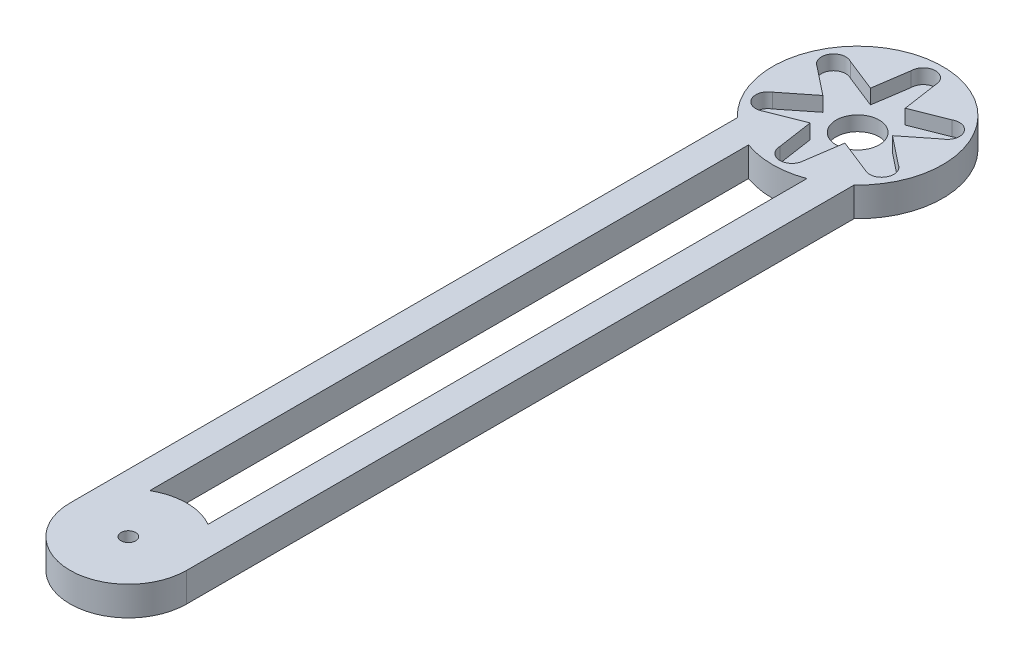
ISO-10303-21;
HEADER;
FILE_DESCRIPTION(('STEP AP214'),'2;1');
FILE_NAME('part.step','',(''),(''),'','','');
FILE_SCHEMA(('AUTOMOTIVE_DESIGN { 1 0 10303 214 1 1 1 1 }'));
ENDSEC;
DATA;
#1=APPLICATION_CONTEXT('core data for automotive mechanical design processes');
#2=APPLICATION_PROTOCOL_DEFINITION('international standard','automotive_design',2000,#1);
#3=PRODUCT_CONTEXT('',#1,'mechanical');
#4=PRODUCT('Part','Part','',(#3));
#5=PRODUCT_RELATED_PRODUCT_CATEGORY('part','',(#4));
#6=PRODUCT_DEFINITION_FORMATION('','',#4);
#7=PRODUCT_DEFINITION_CONTEXT('part definition',#1,'design');
#8=PRODUCT_DEFINITION('design','',#6,#7);
#9=PRODUCT_DEFINITION_SHAPE('','',#8);
#10=(LENGTH_UNIT() NAMED_UNIT(*) SI_UNIT(.MILLI.,.METRE.));
#11=(NAMED_UNIT(*) PLANE_ANGLE_UNIT() SI_UNIT($,.RADIAN.));
#12=(NAMED_UNIT(*) SI_UNIT($,.STERADIAN.) SOLID_ANGLE_UNIT());
#13=UNCERTAINTY_MEASURE_WITH_UNIT(LENGTH_MEASURE(1.E-05),#10,'distance_accuracy_value','');
#14=(GEOMETRIC_REPRESENTATION_CONTEXT(3) GLOBAL_UNCERTAINTY_ASSIGNED_CONTEXT((#13)) GLOBAL_UNIT_ASSIGNED_CONTEXT((#10,
#11,#12)) REPRESENTATION_CONTEXT('',''));
#15=CARTESIAN_POINT('',(0.,0.,0.));
#16=DIRECTION('',(0.,0.,1.));
#17=DIRECTION('',(1.,0.,0.));
#18=AXIS2_PLACEMENT_3D('',#15,#16,#17);
#19=CARTESIAN_POINT('',(0.,6.,0.));
#20=DIRECTION('',(0.,-1.,0.));
#21=DIRECTION('',(0.,0.,-1.));
#22=AXIS2_PLACEMENT_3D('',#19,#20,#21);
#23=CYLINDRICAL_SURFACE('',#22,17.5);
#24=DIRECTION('',(0.,-1.,0.));
#25=VECTOR('',#24,1.);
#26=CARTESIAN_POINT('',(-12.,6.,12.737739202857));
#27=LINE('',#26,#25);
#28=CARTESIAN_POINT('',(-12.,6.,12.737739202857));
#29=VERTEX_POINT('',#28);
#30=CARTESIAN_POINT('',(-12.,0.,12.737739202857));
#31=VERTEX_POINT('',#30);
#32=EDGE_CURVE('E117',#29,#31,#27,.T.);
#33=ORIENTED_EDGE('',*,*,#32,.F.);
#34=CARTESIAN_POINT('',(0.,6.,0.));
#35=DIRECTION('',(0.,1.,0.));
#36=DIRECTION('',(0.,0.,1.));
#37=AXIS2_PLACEMENT_3D('',#34,#35,#36);
#38=CIRCLE('',#37,17.5);
#39=CARTESIAN_POINT('',(12.,6.,12.737739202857));
#40=VERTEX_POINT('',#39);
#41=EDGE_CURVE('E444',#40,#29,#38,.T.);
#42=ORIENTED_EDGE('',*,*,#41,.F.);
#43=DIRECTION('',(0.,-1.,0.));
#44=VECTOR('',#43,1.);
#45=CARTESIAN_POINT('',(12.,6.,12.737739202857));
#46=LINE('',#45,#44);
#47=CARTESIAN_POINT('',(12.,0.,12.737739202857));
#48=VERTEX_POINT('',#47);
#49=EDGE_CURVE('E335',#40,#48,#46,.T.);
#50=ORIENTED_EDGE('',*,*,#49,.T.);
#51=CARTESIAN_POINT('',(0.,0.,0.));
#52=DIRECTION('',(0.,1.,0.));
#53=DIRECTION('',(0.,0.,1.));
#54=AXIS2_PLACEMENT_3D('',#51,#52,#53);
#55=CIRCLE('',#54,17.5);
#56=EDGE_CURVE('E398',#48,#31,#55,.T.);
#57=ORIENTED_EDGE('',*,*,#56,.T.);
#58=EDGE_LOOP('',(#33,#42,#50,#57));
#59=FACE_BOUND('',#58,.T.);
#60=ADVANCED_FACE('F94',(#59),#23,.T.);
#61=CARTESIAN_POINT('',(-11.6913429510899,6.,-6.74999999999999));
#62=DIRECTION('',(0.,-1.,0.));
#63=DIRECTION('',(0.,0.,-1.));
#64=AXIS2_PLACEMENT_3D('',#61,#62,#63);
#65=CYLINDRICAL_SURFACE('',#64,2.5);
#66=CARTESIAN_POINT('',(-11.6913429510899,3.,-6.74999999999999));
#67=DIRECTION('',(0.,1.,0.));
#68=DIRECTION('',(0.,0.,1.));
#69=AXIS2_PLACEMENT_3D('',#66,#67,#68);
#70=CIRCLE('',#69,2.5);
#71=CARTESIAN_POINT('',(-10.4413429510899,3.,-8.91506350946109));
#72=VERTEX_POINT('',#71);
#73=CARTESIAN_POINT('',(-12.9413429510899,3.,-4.58493649053889));
#74=VERTEX_POINT('',#73);
#75=EDGE_CURVE('E365',#72,#74,#70,.T.);
#76=ORIENTED_EDGE('',*,*,#75,.F.);
#77=DIRECTION('',(0.,-1.,0.));
#78=VECTOR('',#77,1.);
#79=CARTESIAN_POINT('',(-10.4413429510899,6.,-8.91506350946109));
#80=LINE('',#79,#78);
#81=CARTESIAN_POINT('',(-10.4413429510899,6.,-8.91506350946109));
#82=VERTEX_POINT('',#81);
#83=EDGE_CURVE('E12',#82,#72,#80,.T.);
#84=ORIENTED_EDGE('',*,*,#83,.F.);
#85=CARTESIAN_POINT('',(-11.6913429510899,6.,-6.74999999999999));
#86=DIRECTION('',(0.,1.,0.));
#87=DIRECTION('',(0.,0.,1.));
#88=AXIS2_PLACEMENT_3D('',#85,#86,#87);
#89=CIRCLE('',#88,2.5);
#90=CARTESIAN_POINT('',(-12.9413429510899,6.,-4.58493649053889));
#91=VERTEX_POINT('',#90);
#92=EDGE_CURVE('E394',#82,#91,#89,.T.);
#93=ORIENTED_EDGE('',*,*,#92,.T.);
#94=DIRECTION('',(0.,-1.,0.));
#95=VECTOR('',#94,1.);
#96=CARTESIAN_POINT('',(-12.9413429510899,6.,-4.58493649053889));
#97=LINE('',#96,#95);
#98=EDGE_CURVE('E446',#91,#74,#97,.T.);
#99=ORIENTED_EDGE('',*,*,#98,.T.);
#100=EDGE_LOOP('',(#76,#84,#93,#99));
#101=FACE_BOUND('',#100,.T.);
#102=ADVANCED_FACE('F96',(#101),#65,.F.);
#103=CARTESIAN_POINT('',(1.63672705202787,6.,-4.13959239881188));
#104=DIRECTION('',(0.367686867782864,0.,-0.929949658454707));
#105=DIRECTION('',(-0.929949658454707,0.,-0.367686867782864));
#106=AXIS2_PLACEMENT_3D('',#103,#104,#105);
#107=PLANE('',#106);
#108=ORIENTED_EDGE('',*,*,#83,.T.);
#109=DIRECTION('',(0.929949658454707,0.,0.367686867782864));
#110=VECTOR('',#109,1.);
#111=CARTESIAN_POINT('',(1.63672705202787,3.,-4.13959239881188));
#112=LINE('',#111,#110);
#113=CARTESIAN_POINT('',(-3.58109149415789,3.,-6.20263241443421));
#114=VERTEX_POINT('',#113);
#115=EDGE_CURVE('E363',#72,#114,#112,.T.);
#116=ORIENTED_EDGE('',*,*,#115,.T.);
#117=DIRECTION('',(0.,-1.,0.));
#118=VECTOR('',#117,1.);
#119=CARTESIAN_POINT('',(-3.58109149415789,6.,-6.20263241443421));
#120=LINE('',#119,#118);
#121=CARTESIAN_POINT('',(-3.58109149415789,6.,-6.20263241443421));
#122=VERTEX_POINT('',#121);
#123=EDGE_CURVE('E102',#122,#114,#120,.T.);
#124=ORIENTED_EDGE('',*,*,#123,.F.);
#125=DIRECTION('',(0.929949658454707,0.,0.367686867782864));
#126=VECTOR('',#125,1.);
#127=CARTESIAN_POINT('',(1.63672705202787,6.,-4.13959239881188));
#128=LINE('',#127,#126);
#129=EDGE_CURVE('E397',#82,#122,#128,.T.);
#130=ORIENTED_EDGE('',*,*,#129,.F.);
#131=EDGE_LOOP('',(#108,#116,#124,#130));
#132=FACE_BOUND('',#131,.T.);
#133=ADVANCED_FACE('F515',(#132),#107,.F.);
#134=CARTESIAN_POINT('',(-4.40335570469799,6.,-0.65234899328859));
#135=DIRECTION('',(0.989203462353871,0.,0.146548661089462));
#136=DIRECTION('',(0.146548661089462,0.,-0.989203462353871));
#137=AXIS2_PLACEMENT_3D('',#134,#135,#136);
#138=PLANE('',#137);
#139=DIRECTION('',(-0.146548661089462,0.,0.989203462353871));
#140=VECTOR('',#139,1.);
#141=CARTESIAN_POINT('',(-4.40335570469799,3.,-0.65234899328859));
#142=LINE('',#141,#140);
#143=CARTESIAN_POINT('',(-2.5,3.,-13.5));
#144=VERTEX_POINT('',#143);
#145=EDGE_CURVE('E360',#144,#114,#142,.T.);
#146=ORIENTED_EDGE('',*,*,#145,.F.);
#147=DIRECTION('',(0.,-1.,0.));
#148=VECTOR('',#147,1.);
#149=CARTESIAN_POINT('',(-2.5,6.,-13.5));
#150=LINE('',#149,#148);
#151=CARTESIAN_POINT('',(-2.5,6.,-13.5));
#152=VERTEX_POINT('',#151);
#153=EDGE_CURVE('E490',#152,#144,#150,.T.);
#154=ORIENTED_EDGE('',*,*,#153,.F.);
#155=DIRECTION('',(-0.146548661089462,0.,0.989203462353871));
#156=VECTOR('',#155,1.);
#157=CARTESIAN_POINT('',(-4.40335570469799,6.,-0.65234899328859));
#158=LINE('',#157,#156);
#159=EDGE_CURVE('E400',#152,#122,#158,.T.);
#160=ORIENTED_EDGE('',*,*,#159,.T.);
#161=ORIENTED_EDGE('',*,*,#123,.T.);
#162=EDGE_LOOP('',(#146,#154,#160,#161));
#163=FACE_BOUND('',#162,.T.);
#164=ADVANCED_FACE('F495',(#163),#138,.T.);
#165=CARTESIAN_POINT('',(0.,6.,-13.5));
#166=DIRECTION('',(0.,-1.,0.));
#167=DIRECTION('',(0.,0.,-1.));
#168=AXIS2_PLACEMENT_3D('',#165,#166,#167);
#169=CYLINDRICAL_SURFACE('',#168,2.5);
#170=CARTESIAN_POINT('',(0.,3.,-13.5));
#171=DIRECTION('',(0.,1.,0.));
#172=DIRECTION('',(0.,0.,1.));
#173=AXIS2_PLACEMENT_3D('',#170,#171,#172);
#174=CIRCLE('',#173,2.5);
#175=CARTESIAN_POINT('',(2.5,3.,-13.5));
#176=VERTEX_POINT('',#175);
#177=EDGE_CURVE('E357',#176,#144,#174,.T.);
#178=ORIENTED_EDGE('',*,*,#177,.F.);
#179=DIRECTION('',(0.,-1.,0.));
#180=VECTOR('',#179,1.);
#181=CARTESIAN_POINT('',(2.5,6.,-13.5));
#182=LINE('',#181,#180);
#183=CARTESIAN_POINT('',(2.5,6.,-13.5));
#184=VERTEX_POINT('',#183);
#185=EDGE_CURVE('E487',#184,#176,#182,.T.);
#186=ORIENTED_EDGE('',*,*,#185,.F.);
#187=CARTESIAN_POINT('',(0.,6.,-13.5));
#188=DIRECTION('',(0.,1.,0.));
#189=DIRECTION('',(0.,0.,1.));
#190=AXIS2_PLACEMENT_3D('',#187,#188,#189);
#191=CIRCLE('',#190,2.5);
#192=EDGE_CURVE('E403',#184,#152,#191,.T.);
#193=ORIENTED_EDGE('',*,*,#192,.T.);
#194=ORIENTED_EDGE('',*,*,#153,.T.);
#195=EDGE_LOOP('',(#178,#186,#193,#194));
#196=FACE_BOUND('',#195,.T.);
#197=ADVANCED_FACE('F505',(#196),#169,.F.);
#198=CARTESIAN_POINT('',(4.40335570469799,6.,-0.65234899328859));
#199=DIRECTION('',(0.989203462353871,0.,-0.146548661089462));
#200=DIRECTION('',(-0.146548661089462,0.,-0.989203462353871));
#201=AXIS2_PLACEMENT_3D('',#198,#199,#200);
#202=PLANE('',#201);
#203=ORIENTED_EDGE('',*,*,#185,.T.);
#204=DIRECTION('',(0.146548661089462,0.,0.989203462353871));
#205=VECTOR('',#204,1.);
#206=CARTESIAN_POINT('',(4.40335570469799,3.,-0.65234899328859));
#207=LINE('',#206,#205);
#208=CARTESIAN_POINT('',(3.58109149415789,3.,-6.20263241443422));
#209=VERTEX_POINT('',#208);
#210=EDGE_CURVE('E355',#176,#209,#207,.T.);
#211=ORIENTED_EDGE('',*,*,#210,.T.);
#212=DIRECTION('',(0.,-1.,0.));
#213=VECTOR('',#212,1.);
#214=CARTESIAN_POINT('',(3.58109149415789,6.,-6.20263241443422));
#215=LINE('',#214,#213);
#216=CARTESIAN_POINT('',(3.58109149415789,6.,-6.20263241443422));
#217=VERTEX_POINT('',#216);
#218=EDGE_CURVE('E484',#217,#209,#215,.T.);
#219=ORIENTED_EDGE('',*,*,#218,.F.);
#220=DIRECTION('',(0.146548661089462,0.,0.989203462353871));
#221=VECTOR('',#220,1.);
#222=CARTESIAN_POINT('',(4.40335570469799,6.,-0.65234899328859));
#223=LINE('',#222,#221);
#224=EDGE_CURVE('E406',#184,#217,#223,.T.);
#225=ORIENTED_EDGE('',*,*,#224,.F.);
#226=EDGE_LOOP('',(#203,#211,#219,#225));
#227=FACE_BOUND('',#226,.T.);
#228=ADVANCED_FACE('F508',(#227),#202,.F.);
#229=CARTESIAN_POINT('',(-1.63672705202787,6.,-4.13959239881188));
#230=DIRECTION('',(0.367686867782865,0.,0.929949658454707));
#231=DIRECTION('',(0.929949658454707,0.,-0.367686867782865));
#232=AXIS2_PLACEMENT_3D('',#229,#230,#231);
#233=PLANE('',#232);
#234=DIRECTION('',(-0.929949658454707,0.,0.367686867782865));
#235=VECTOR('',#234,1.);
#236=CARTESIAN_POINT('',(-1.63672705202787,3.,-4.13959239881188));
#237=LINE('',#236,#235);
#238=CARTESIAN_POINT('',(10.4413429510899,3.,-8.9150635094611));
#239=VERTEX_POINT('',#238);
#240=EDGE_CURVE('E352',#239,#209,#237,.T.);
#241=ORIENTED_EDGE('',*,*,#240,.F.);
#242=DIRECTION('',(0.,-1.,0.));
#243=VECTOR('',#242,1.);
#244=CARTESIAN_POINT('',(10.4413429510899,6.,-8.9150635094611));
#245=LINE('',#244,#243);
#246=CARTESIAN_POINT('',(10.4413429510899,6.,-8.9150635094611));
#247=VERTEX_POINT('',#246);
#248=EDGE_CURVE('E481',#247,#239,#245,.T.);
#249=ORIENTED_EDGE('',*,*,#248,.F.);
#250=DIRECTION('',(-0.929949658454707,0.,0.367686867782865));
#251=VECTOR('',#250,1.);
#252=CARTESIAN_POINT('',(-1.63672705202787,6.,-4.13959239881188));
#253=LINE('',#252,#251);
#254=EDGE_CURVE('E408',#247,#217,#253,.T.);
#255=ORIENTED_EDGE('',*,*,#254,.T.);
#256=ORIENTED_EDGE('',*,*,#218,.T.);
#257=EDGE_LOOP('',(#241,#249,#255,#256));
#258=FACE_BOUND('',#257,.T.);
#259=ADVANCED_FACE('F561',(#258),#233,.T.);
#260=CARTESIAN_POINT('',(11.6913429510899,6.,-6.75));
#261=DIRECTION('',(0.,-1.,0.));
#262=DIRECTION('',(0.,0.,-1.));
#263=AXIS2_PLACEMENT_3D('',#260,#261,#262);
#264=CYLINDRICAL_SURFACE('',#263,2.5);
#265=CARTESIAN_POINT('',(11.6913429510899,3.,-6.75));
#266=DIRECTION('',(0.,1.,0.));
#267=DIRECTION('',(0.,0.,1.));
#268=AXIS2_PLACEMENT_3D('',#265,#266,#267);
#269=CIRCLE('',#268,2.5);
#270=CARTESIAN_POINT('',(12.9413429510899,3.,-4.58493649053891));
#271=VERTEX_POINT('',#270);
#272=EDGE_CURVE('E349',#271,#239,#269,.T.);
#273=ORIENTED_EDGE('',*,*,#272,.F.);
#274=DIRECTION('',(0.,-1.,0.));
#275=VECTOR('',#274,1.);
#276=CARTESIAN_POINT('',(12.9413429510899,6.,-4.58493649053891));
#277=LINE('',#276,#275);
#278=CARTESIAN_POINT('',(12.9413429510899,6.,-4.58493649053891));
#279=VERTEX_POINT('',#278);
#280=EDGE_CURVE('E478',#279,#271,#277,.T.);
#281=ORIENTED_EDGE('',*,*,#280,.F.);
#282=CARTESIAN_POINT('',(11.6913429510899,6.,-6.75));
#283=DIRECTION('',(0.,1.,0.));
#284=DIRECTION('',(0.,0.,1.));
#285=AXIS2_PLACEMENT_3D('',#282,#283,#284);
#286=CIRCLE('',#285,2.5);
#287=EDGE_CURVE('E411',#279,#247,#286,.T.);
#288=ORIENTED_EDGE('',*,*,#287,.T.);
#289=ORIENTED_EDGE('',*,*,#248,.T.);
#290=EDGE_LOOP('',(#273,#281,#288,#289));
#291=FACE_BOUND('',#290,.T.);
#292=ADVANCED_FACE('F559',(#291),#264,.F.);
#293=CARTESIAN_POINT('',(2.76662865267012,6.,3.48724340552329));
#294=DIRECTION('',(0.621516594571006,0.,0.783400997365245));
#295=DIRECTION('',(0.783400997365244,0.,-0.621516594571006));
#296=AXIS2_PLACEMENT_3D('',#293,#294,#295);
#297=PLANE('',#296);
#298=ORIENTED_EDGE('',*,*,#280,.T.);
#299=DIRECTION('',(-0.783400997365245,0.,0.621516594571006));
#300=VECTOR('',#299,1.);
#301=CARTESIAN_POINT('',(2.76662865267012,3.,3.48724340552329));
#302=LINE('',#301,#300);
#303=CARTESIAN_POINT('',(7.16218298831579,3.,0.));
#304=VERTEX_POINT('',#303);
#305=EDGE_CURVE('E347',#271,#304,#302,.T.);
#306=ORIENTED_EDGE('',*,*,#305,.T.);
#307=DIRECTION('',(0.,-1.,0.));
#308=VECTOR('',#307,1.);
#309=CARTESIAN_POINT('',(7.16218298831579,6.,0.));
#310=LINE('',#309,#308);
#311=CARTESIAN_POINT('',(7.16218298831579,6.,0.));
#312=VERTEX_POINT('',#311);
#313=EDGE_CURVE('E475',#312,#304,#310,.T.);
#314=ORIENTED_EDGE('',*,*,#313,.F.);
#315=DIRECTION('',(-0.783400997365245,0.,0.621516594571006));
#316=VECTOR('',#315,1.);
#317=CARTESIAN_POINT('',(2.76662865267012,6.,3.48724340552329));
#318=LINE('',#317,#316);
#319=EDGE_CURVE('E414',#279,#312,#318,.T.);
#320=ORIENTED_EDGE('',*,*,#319,.F.);
#321=EDGE_LOOP('',(#298,#306,#314,#320));
#322=FACE_BOUND('',#321,.T.);
#323=ADVANCED_FACE('F556',(#322),#297,.F.);
#324=CARTESIAN_POINT('',(2.76662865267012,6.,-3.48724340552329));
#325=DIRECTION('',(-0.621516594571006,0.,0.783400997365244));
#326=DIRECTION('',(0.783400997365245,0.,0.621516594571006));
#327=AXIS2_PLACEMENT_3D('',#324,#325,#326);
#328=PLANE('',#327);
#329=DIRECTION('',(-0.783400997365245,0.,-0.621516594571006));
#330=VECTOR('',#329,1.);
#331=CARTESIAN_POINT('',(2.76662865267012,3.,-3.48724340552329));
#332=LINE('',#331,#330);
#333=CARTESIAN_POINT('',(12.9413429510899,3.,4.5849364905389));
#334=VERTEX_POINT('',#333);
#335=EDGE_CURVE('E344',#334,#304,#332,.T.);
#336=ORIENTED_EDGE('',*,*,#335,.F.);
#337=DIRECTION('',(0.,-1.,0.));
#338=VECTOR('',#337,1.);
#339=CARTESIAN_POINT('',(12.9413429510899,6.,4.5849364905389));
#340=LINE('',#339,#338);
#341=CARTESIAN_POINT('',(12.9413429510899,6.,4.5849364905389));
#342=VERTEX_POINT('',#341);
#343=EDGE_CURVE('E472',#342,#334,#340,.T.);
#344=ORIENTED_EDGE('',*,*,#343,.F.);
#345=DIRECTION('',(-0.783400997365245,0.,-0.621516594571006));
#346=VECTOR('',#345,1.);
#347=CARTESIAN_POINT('',(2.76662865267012,6.,-3.48724340552329));
#348=LINE('',#347,#346);
#349=EDGE_CURVE('E416',#342,#312,#348,.T.);
#350=ORIENTED_EDGE('',*,*,#349,.T.);
#351=ORIENTED_EDGE('',*,*,#313,.T.);
#352=EDGE_LOOP('',(#336,#344,#350,#351));
#353=FACE_BOUND('',#352,.T.);
#354=ADVANCED_FACE('F551',(#353),#328,.T.);
#355=CARTESIAN_POINT('',(11.6913429510899,6.,6.75));
#356=DIRECTION('',(0.,-1.,0.));
#357=DIRECTION('',(0.,0.,-1.));
#358=AXIS2_PLACEMENT_3D('',#355,#356,#357);
#359=CYLINDRICAL_SURFACE('',#358,2.5);
#360=CARTESIAN_POINT('',(11.6913429510899,3.,6.75));
#361=DIRECTION('',(0.,1.,0.));
#362=DIRECTION('',(0.,0.,1.));
#363=AXIS2_PLACEMENT_3D('',#360,#361,#362);
#364=CIRCLE('',#363,2.5);
#365=CARTESIAN_POINT('',(10.4413429510899,3.,8.9150635094611));
#366=VERTEX_POINT('',#365);
#367=EDGE_CURVE('E341',#366,#334,#364,.T.);
#368=ORIENTED_EDGE('',*,*,#367,.F.);
#369=DIRECTION('',(0.,-1.,0.));
#370=VECTOR('',#369,1.);
#371=CARTESIAN_POINT('',(10.4413429510899,6.,8.9150635094611));
#372=LINE('',#371,#370);
#373=CARTESIAN_POINT('',(10.4413429510899,6.,8.9150635094611));
#374=VERTEX_POINT('',#373);
#375=EDGE_CURVE('E469',#374,#366,#372,.T.);
#376=ORIENTED_EDGE('',*,*,#375,.F.);
#377=CARTESIAN_POINT('',(11.6913429510899,6.,6.75));
#378=DIRECTION('',(0.,1.,0.));
#379=DIRECTION('',(0.,0.,1.));
#380=AXIS2_PLACEMENT_3D('',#377,#378,#379);
#381=CIRCLE('',#380,2.5);
#382=EDGE_CURVE('E419',#374,#342,#381,.T.);
#383=ORIENTED_EDGE('',*,*,#382,.T.);
#384=ORIENTED_EDGE('',*,*,#343,.T.);
#385=EDGE_LOOP('',(#368,#376,#383,#384));
#386=FACE_BOUND('',#385,.T.);
#387=ADVANCED_FACE('F548',(#386),#359,.F.);
#388=CARTESIAN_POINT('',(-1.63672705202787,6.,4.13959239881188));
#389=DIRECTION('',(-0.367686867782865,0.,0.929949658454707));
#390=DIRECTION('',(0.929949658454707,0.,0.367686867782865));
#391=AXIS2_PLACEMENT_3D('',#388,#389,#390);
#392=PLANE('',#391);
#393=ORIENTED_EDGE('',*,*,#375,.T.);
#394=DIRECTION('',(-0.929949658454707,0.,-0.367686867782865));
#395=VECTOR('',#394,1.);
#396=CARTESIAN_POINT('',(-1.63672705202787,3.,4.13959239881188));
#397=LINE('',#396,#395);
#398=CARTESIAN_POINT('',(3.58109149415789,3.,6.20263241443421));
#399=VERTEX_POINT('',#398);
#400=EDGE_CURVE('E339',#366,#399,#397,.T.);
#401=ORIENTED_EDGE('',*,*,#400,.T.);
#402=DIRECTION('',(0.,-1.,0.));
#403=VECTOR('',#402,1.);
#404=CARTESIAN_POINT('',(3.58109149415789,6.,6.20263241443421));
#405=LINE('',#404,#403);
#406=CARTESIAN_POINT('',(3.58109149415789,6.,6.20263241443421));
#407=VERTEX_POINT('',#406);
#408=EDGE_CURVE('E466',#407,#399,#405,.T.);
#409=ORIENTED_EDGE('',*,*,#408,.F.);
#410=DIRECTION('',(-0.929949658454707,0.,-0.367686867782865));
#411=VECTOR('',#410,1.);
#412=CARTESIAN_POINT('',(-1.63672705202787,6.,4.13959239881188));
#413=LINE('',#412,#411);
#414=EDGE_CURVE('E422',#374,#407,#413,.T.);
#415=ORIENTED_EDGE('',*,*,#414,.F.);
#416=EDGE_LOOP('',(#393,#401,#409,#415));
#417=FACE_BOUND('',#416,.T.);
#418=ADVANCED_FACE('F545',(#417),#392,.F.);
#419=CARTESIAN_POINT('',(4.40335570469799,6.,0.65234899328859));
#420=DIRECTION('',(-0.989203462353871,0.,-0.146548661089462));
#421=DIRECTION('',(-0.146548661089462,0.,0.989203462353871));
#422=AXIS2_PLACEMENT_3D('',#419,#420,#421);
#423=PLANE('',#422);
#424=DIRECTION('',(0.146548661089462,0.,-0.989203462353871));
#425=VECTOR('',#424,1.);
#426=CARTESIAN_POINT('',(4.40335570469799,3.,0.65234899328859));
#427=LINE('',#426,#425);
#428=CARTESIAN_POINT('',(2.5,3.,13.5));
#429=VERTEX_POINT('',#428);
#430=EDGE_CURVE('E385',#429,#399,#427,.T.);
#431=ORIENTED_EDGE('',*,*,#430,.F.);
#432=DIRECTION('',(0.,-1.,0.));
#433=VECTOR('',#432,1.);
#434=CARTESIAN_POINT('',(2.5,6.,13.5));
#435=LINE('',#434,#433);
#436=CARTESIAN_POINT('',(2.5,6.,13.5));
#437=VERTEX_POINT('',#436);
#438=EDGE_CURVE('E463',#437,#429,#435,.T.);
#439=ORIENTED_EDGE('',*,*,#438,.F.);
#440=DIRECTION('',(0.146548661089462,0.,-0.989203462353871));
#441=VECTOR('',#440,1.);
#442=CARTESIAN_POINT('',(4.40335570469799,6.,0.65234899328859));
#443=LINE('',#442,#441);
#444=EDGE_CURVE('E424',#437,#407,#443,.T.);
#445=ORIENTED_EDGE('',*,*,#444,.T.);
#446=ORIENTED_EDGE('',*,*,#408,.T.);
#447=EDGE_LOOP('',(#431,#439,#445,#446));
#448=FACE_BOUND('',#447,.T.);
#449=ADVANCED_FACE('F540',(#448),#423,.T.);
#450=CARTESIAN_POINT('',(0.,6.,13.5));
#451=DIRECTION('',(0.,-1.,0.));
#452=DIRECTION('',(0.,0.,-1.));
#453=AXIS2_PLACEMENT_3D('',#450,#451,#452);
#454=CYLINDRICAL_SURFACE('',#453,2.5);
#455=CARTESIAN_POINT('',(0.,3.,13.5));
#456=DIRECTION('',(0.,1.,0.));
#457=DIRECTION('',(0.,0.,1.));
#458=AXIS2_PLACEMENT_3D('',#455,#456,#457);
#459=CIRCLE('',#458,2.5);
#460=CARTESIAN_POINT('',(-2.5,3.,13.5));
#461=VERTEX_POINT('',#460);
#462=EDGE_CURVE('E382',#461,#429,#459,.T.);
#463=ORIENTED_EDGE('',*,*,#462,.F.);
#464=DIRECTION('',(0.,-1.,0.));
#465=VECTOR('',#464,1.);
#466=CARTESIAN_POINT('',(-2.5,6.,13.5));
#467=LINE('',#466,#465);
#468=CARTESIAN_POINT('',(-2.5,6.,13.5));
#469=VERTEX_POINT('',#468);
#470=EDGE_CURVE('E460',#469,#461,#467,.T.);
#471=ORIENTED_EDGE('',*,*,#470,.F.);
#472=CARTESIAN_POINT('',(0.,6.,13.5));
#473=DIRECTION('',(0.,1.,0.));
#474=DIRECTION('',(0.,0.,1.));
#475=AXIS2_PLACEMENT_3D('',#472,#473,#474);
#476=CIRCLE('',#475,2.5);
#477=EDGE_CURVE('E427',#469,#437,#476,.T.);
#478=ORIENTED_EDGE('',*,*,#477,.T.);
#479=ORIENTED_EDGE('',*,*,#438,.T.);
#480=EDGE_LOOP('',(#463,#471,#478,#479));
#481=FACE_BOUND('',#480,.T.);
#482=ADVANCED_FACE('F537',(#481),#454,.F.);
#483=CARTESIAN_POINT('',(-4.40335570469799,6.,0.652348993288591));
#484=DIRECTION('',(-0.989203462353871,0.,0.146548661089462));
#485=DIRECTION('',(0.146548661089462,0.,0.989203462353871));
#486=AXIS2_PLACEMENT_3D('',#483,#484,#485);
#487=PLANE('',#486);
#488=ORIENTED_EDGE('',*,*,#470,.T.);
#489=DIRECTION('',(-0.146548661089462,0.,-0.989203462353871));
#490=VECTOR('',#489,1.);
#491=CARTESIAN_POINT('',(-4.40335570469799,3.,0.652348993288591));
#492=LINE('',#491,#490);
#493=CARTESIAN_POINT('',(-3.58109149415789,3.,6.20263241443422));
#494=VERTEX_POINT('',#493);
#495=EDGE_CURVE('E380',#461,#494,#492,.T.);
#496=ORIENTED_EDGE('',*,*,#495,.T.);
#497=DIRECTION('',(0.,-1.,0.));
#498=VECTOR('',#497,1.);
#499=CARTESIAN_POINT('',(-3.58109149415789,6.,6.20263241443422));
#500=LINE('',#499,#498);
#501=CARTESIAN_POINT('',(-3.58109149415789,6.,6.20263241443422));
#502=VERTEX_POINT('',#501);
#503=EDGE_CURVE('E457',#502,#494,#500,.T.);
#504=ORIENTED_EDGE('',*,*,#503,.F.);
#505=DIRECTION('',(-0.146548661089462,0.,-0.989203462353871));
#506=VECTOR('',#505,1.);
#507=CARTESIAN_POINT('',(-4.40335570469799,6.,0.652348993288591));
#508=LINE('',#507,#506);
#509=EDGE_CURVE('E430',#469,#502,#508,.T.);
#510=ORIENTED_EDGE('',*,*,#509,.F.);
#511=EDGE_LOOP('',(#488,#496,#504,#510));
#512=FACE_BOUND('',#511,.T.);
#513=ADVANCED_FACE('F534',(#512),#487,.F.);
#514=CARTESIAN_POINT('',(1.63672705202787,6.,4.13959239881188));
#515=DIRECTION('',(-0.367686867782865,0.,-0.929949658454707));
#516=DIRECTION('',(-0.929949658454707,0.,0.367686867782865));
#517=AXIS2_PLACEMENT_3D('',#514,#515,#516);
#518=PLANE('',#517);
#519=DIRECTION('',(0.929949658454707,0.,-0.367686867782865));
#520=VECTOR('',#519,1.);
#521=CARTESIAN_POINT('',(1.63672705202787,3.,4.13959239881188));
#522=LINE('',#521,#520);
#523=CARTESIAN_POINT('',(-10.4413429510899,3.,8.9150635094611));
#524=VERTEX_POINT('',#523);
#525=EDGE_CURVE('E377',#524,#494,#522,.T.);
#526=ORIENTED_EDGE('',*,*,#525,.F.);
#527=DIRECTION('',(0.,-1.,0.));
#528=VECTOR('',#527,1.);
#529=CARTESIAN_POINT('',(-10.4413429510899,6.,8.9150635094611));
#530=LINE('',#529,#528);
#531=CARTESIAN_POINT('',(-10.4413429510899,6.,8.9150635094611));
#532=VERTEX_POINT('',#531);
#533=EDGE_CURVE('E454',#532,#524,#530,.T.);
#534=ORIENTED_EDGE('',*,*,#533,.F.);
#535=DIRECTION('',(0.929949658454707,0.,-0.367686867782865));
#536=VECTOR('',#535,1.);
#537=CARTESIAN_POINT('',(1.63672705202787,6.,4.13959239881188));
#538=LINE('',#537,#536);
#539=EDGE_CURVE('E432',#532,#502,#538,.T.);
#540=ORIENTED_EDGE('',*,*,#539,.T.);
#541=ORIENTED_EDGE('',*,*,#503,.T.);
#542=EDGE_LOOP('',(#526,#534,#540,#541));
#543=FACE_BOUND('',#542,.T.);
#544=ADVANCED_FACE('F529',(#543),#518,.T.);
#545=CARTESIAN_POINT('',(-11.6913429510899,6.,6.75000000000001));
#546=DIRECTION('',(0.,-1.,0.));
#547=DIRECTION('',(0.,0.,-1.));
#548=AXIS2_PLACEMENT_3D('',#545,#546,#547);
#549=CYLINDRICAL_SURFACE('',#548,2.5);
#550=CARTESIAN_POINT('',(-11.6913429510899,3.,6.75000000000001));
#551=DIRECTION('',(0.,1.,0.));
#552=DIRECTION('',(0.,0.,1.));
#553=AXIS2_PLACEMENT_3D('',#550,#551,#552);
#554=CIRCLE('',#553,2.5);
#555=CARTESIAN_POINT('',(-12.9413429510899,3.,4.58493649053891));
#556=VERTEX_POINT('',#555);
#557=EDGE_CURVE('E374',#556,#524,#554,.T.);
#558=ORIENTED_EDGE('',*,*,#557,.F.);
#559=DIRECTION('',(0.,-1.,0.));
#560=VECTOR('',#559,1.);
#561=CARTESIAN_POINT('',(-12.9413429510899,6.,4.58493649053891));
#562=LINE('',#561,#560);
#563=CARTESIAN_POINT('',(-12.9413429510899,6.,4.58493649053891));
#564=VERTEX_POINT('',#563);
#565=EDGE_CURVE('E451',#564,#556,#562,.T.);
#566=ORIENTED_EDGE('',*,*,#565,.F.);
#567=CARTESIAN_POINT('',(-11.6913429510899,6.,6.75000000000001));
#568=DIRECTION('',(0.,1.,0.));
#569=DIRECTION('',(0.,0.,1.));
#570=AXIS2_PLACEMENT_3D('',#567,#568,#569);
#571=CIRCLE('',#570,2.5);
#572=EDGE_CURVE('E435',#564,#532,#571,.T.);
#573=ORIENTED_EDGE('',*,*,#572,.T.);
#574=ORIENTED_EDGE('',*,*,#533,.T.);
#575=EDGE_LOOP('',(#558,#566,#573,#574));
#576=FACE_BOUND('',#575,.T.);
#577=ADVANCED_FACE('F526',(#576),#549,.F.);
#578=CARTESIAN_POINT('',(-2.76662865267012,6.,-3.48724340552329));
#579=DIRECTION('',(-0.621516594571006,0.,-0.783400997365244));
#580=DIRECTION('',(-0.783400997365245,0.,0.621516594571006));
#581=AXIS2_PLACEMENT_3D('',#578,#579,#580);
#582=PLANE('',#581);
#583=ORIENTED_EDGE('',*,*,#565,.T.);
#584=DIRECTION('',(0.783400997365244,0.,-0.621516594571006));
#585=VECTOR('',#584,1.);
#586=CARTESIAN_POINT('',(-2.76662865267012,3.,-3.48724340552329));
#587=LINE('',#586,#585);
#588=CARTESIAN_POINT('',(-7.16218298831579,3.,0.));
#589=VERTEX_POINT('',#588);
#590=EDGE_CURVE('E371',#556,#589,#587,.T.);
#591=ORIENTED_EDGE('',*,*,#590,.T.);
#592=DIRECTION('',(0.,-1.,0.));
#593=VECTOR('',#592,1.);
#594=CARTESIAN_POINT('',(-7.16218298831579,6.,0.));
#595=LINE('',#594,#593);
#596=CARTESIAN_POINT('',(-7.16218298831579,6.,0.));
#597=VERTEX_POINT('',#596);
#598=EDGE_CURVE('E449',#597,#589,#595,.T.);
#599=ORIENTED_EDGE('',*,*,#598,.F.);
#600=DIRECTION('',(0.783400997365244,0.,-0.621516594571006));
#601=VECTOR('',#600,1.);
#602=CARTESIAN_POINT('',(-2.76662865267012,6.,-3.48724340552329));
#603=LINE('',#602,#601);
#604=EDGE_CURVE('E438',#564,#597,#603,.T.);
#605=ORIENTED_EDGE('',*,*,#604,.F.);
#606=EDGE_LOOP('',(#583,#591,#599,#605));
#607=FACE_BOUND('',#606,.T.);
#608=ADVANCED_FACE('F523',(#607),#582,.F.);
#609=CARTESIAN_POINT('',(-2.76662865267012,6.,3.48724340552329));
#610=DIRECTION('',(0.621516594571005,0.,-0.783400997365245));
#611=DIRECTION('',(-0.783400997365245,0.,-0.621516594571005));
#612=AXIS2_PLACEMENT_3D('',#609,#610,#611);
#613=PLANE('',#612);
#614=DIRECTION('',(0.783400997365245,0.,0.621516594571005));
#615=VECTOR('',#614,1.);
#616=CARTESIAN_POINT('',(-2.76662865267012,3.,3.48724340552329));
#617=LINE('',#616,#615);
#618=EDGE_CURVE('E368',#74,#589,#617,.T.);
#619=ORIENTED_EDGE('',*,*,#618,.F.);
#620=ORIENTED_EDGE('',*,*,#98,.F.);
#621=DIRECTION('',(0.783400997365245,0.,0.621516594571005));
#622=VECTOR('',#621,1.);
#623=CARTESIAN_POINT('',(-2.76662865267012,6.,3.48724340552329));
#624=LINE('',#623,#622);
#625=EDGE_CURVE('E440',#91,#597,#624,.T.);
#626=ORIENTED_EDGE('',*,*,#625,.T.);
#627=ORIENTED_EDGE('',*,*,#598,.T.);
#628=EDGE_LOOP('',(#619,#620,#626,#627));
#629=FACE_BOUND('',#628,.T.);
#630=ADVANCED_FACE('F519',(#629),#613,.T.);
#631=CARTESIAN_POINT('',(-6.,6.,16.4392822227736));
#632=VERTEX_POINT('',#631);
#633=CARTESIAN_POINT('',(6.,6.,16.4392822227736));
#634=VERTEX_POINT('',#633);
#635=EDGE_CURVE('E109',#632,#634,#38,.T.);
#636=ORIENTED_EDGE('',*,*,#635,.F.);
#637=DIRECTION('',(0.,-1.,0.));
#638=VECTOR('',#637,1.);
#639=CARTESIAN_POINT('',(-6.,6.,16.4392822227736));
#640=LINE('',#639,#638);
#641=CARTESIAN_POINT('',(-6.,0.,16.4392822227736));
#642=VERTEX_POINT('',#641);
#643=EDGE_CURVE('E328',#632,#642,#640,.T.);
#644=ORIENTED_EDGE('',*,*,#643,.T.);
#645=CARTESIAN_POINT('',(6.,0.,16.4392822227736));
#646=VERTEX_POINT('',#645);
#647=EDGE_CURVE('E391',#642,#646,#55,.T.);
#648=ORIENTED_EDGE('',*,*,#647,.T.);
#649=DIRECTION('',(0.,-1.,0.));
#650=VECTOR('',#649,1.);
#651=CARTESIAN_POINT('',(6.,6.,16.4392822227736));
#652=LINE('',#651,#650);
#653=EDGE_CURVE('E288',#634,#646,#652,.T.);
#654=ORIENTED_EDGE('',*,*,#653,.F.);
#655=EDGE_LOOP('',(#636,#644,#648,#654));
#656=FACE_BOUND('',#655,.T.);
#657=ADVANCED_FACE('F572',(#656),#23,.T.);
#658=CARTESIAN_POINT('',(0.,6.,0.));
#659=DIRECTION('',(0.,1.,0.));
#660=DIRECTION('',(0.,0.,1.));
#661=AXIS2_PLACEMENT_3D('',#658,#659,#660);
#662=PLANE('',#661);
#663=ORIENTED_EDGE('',*,*,#41,.T.);
#664=DIRECTION('',(0.,0.,1.));
#665=VECTOR('',#664,1.);
#666=CARTESIAN_POINT('',(-12.,6.,0.));
#667=LINE('',#666,#665);
#668=CARTESIAN_POINT('',(-12.,6.,150.));
#669=VERTEX_POINT('',#668);
#670=EDGE_CURVE('E300',#29,#669,#667,.T.);
#671=ORIENTED_EDGE('',*,*,#670,.T.);
#672=CARTESIAN_POINT('',(0.,6.,150.));
#673=DIRECTION('',(0.,-1.,0.));
#674=DIRECTION('',(0.,0.,-1.));
#675=AXIS2_PLACEMENT_3D('',#672,#673,#674);
#676=CIRCLE('',#675,12.);
#677=CARTESIAN_POINT('',(12.,6.,150.));
#678=VERTEX_POINT('',#677);
#679=EDGE_CURVE('E295',#678,#669,#676,.T.);
#680=ORIENTED_EDGE('',*,*,#679,.F.);
#681=DIRECTION('',(0.,0.,1.));
#682=VECTOR('',#681,1.);
#683=CARTESIAN_POINT('',(12.,6.,0.));
#684=LINE('',#683,#682);
#685=EDGE_CURVE('E278',#40,#678,#684,.T.);
#686=ORIENTED_EDGE('',*,*,#685,.F.);
#687=EDGE_LOOP('',(#663,#671,#680,#686));
#688=FACE_BOUND('',#687,.T.);
#689=ORIENTED_EDGE('',*,*,#92,.F.);
#690=ORIENTED_EDGE('',*,*,#129,.T.);
#691=ORIENTED_EDGE('',*,*,#159,.F.);
#692=ORIENTED_EDGE('',*,*,#192,.F.);
#693=ORIENTED_EDGE('',*,*,#224,.T.);
#694=ORIENTED_EDGE('',*,*,#254,.F.);
#695=ORIENTED_EDGE('',*,*,#287,.F.);
#696=ORIENTED_EDGE('',*,*,#319,.T.);
#697=ORIENTED_EDGE('',*,*,#349,.F.);
#698=ORIENTED_EDGE('',*,*,#382,.F.);
#699=ORIENTED_EDGE('',*,*,#414,.T.);
#700=ORIENTED_EDGE('',*,*,#444,.F.);
#701=ORIENTED_EDGE('',*,*,#477,.F.);
#702=ORIENTED_EDGE('',*,*,#509,.T.);
#703=ORIENTED_EDGE('',*,*,#539,.F.);
#704=ORIENTED_EDGE('',*,*,#572,.F.);
#705=ORIENTED_EDGE('',*,*,#604,.T.);
#706=ORIENTED_EDGE('',*,*,#625,.F.);
#707=EDGE_LOOP('',(#689,#690,#691,#692,#693,#694,#695,#696,#697,#698,#699,#700,#701,#702,#703,
#704,#705,#706));
#708=FACE_BOUND('',#707,.T.);
#709=ORIENTED_EDGE('',*,*,#635,.T.);
#710=DIRECTION('',(0.,0.,1.));
#711=VECTOR('',#710,1.);
#712=CARTESIAN_POINT('',(6.,6.,0.));
#713=LINE('',#712,#711);
#714=CARTESIAN_POINT('',(6.,6.,139.607695154587));
#715=VERTEX_POINT('',#714);
#716=EDGE_CURVE('E268',#634,#715,#713,.T.);
#717=ORIENTED_EDGE('',*,*,#716,.T.);
#718=CARTESIAN_POINT('',(-6.,6.,139.607695154587));
#719=VERTEX_POINT('',#718);
#720=EDGE_CURVE('E274',#719,#715,#676,.T.);
#721=ORIENTED_EDGE('',*,*,#720,.F.);
#722=DIRECTION('',(0.,0.,1.));
#723=VECTOR('',#722,1.);
#724=CARTESIAN_POINT('',(-6.,6.,0.));
#725=LINE('',#724,#723);
#726=EDGE_CURVE('E303',#632,#719,#725,.T.);
#727=ORIENTED_EDGE('',*,*,#726,.F.);
#728=EDGE_LOOP('',(#709,#717,#721,#727));
#729=FACE_BOUND('',#728,.T.);
#730=CARTESIAN_POINT('',(0.,6.,150.));
#731=DIRECTION('',(0.,-1.,0.));
#732=DIRECTION('',(0.,0.,-1.));
#733=AXIS2_PLACEMENT_3D('',#730,#731,#732);
#734=CIRCLE('',#733,1.5);
#735=CARTESIAN_POINT('',(0.,6.,148.5));
#736=VERTEX_POINT('',#735);
#737=EDGE_CURVE('E289',#736,#736,#734,.T.);
#738=ORIENTED_EDGE('',*,*,#737,.T.);
#739=EDGE_LOOP('',(#738));
#740=FACE_BOUND('',#739,.T.);
#741=ADVANCED_FACE('F270',(#688,#708,#729,#740),#662,.T.);
#742=CARTESIAN_POINT('',(0.,0.,0.));
#743=DIRECTION('',(0.,1.,0.));
#744=DIRECTION('',(0.,0.,1.));
#745=AXIS2_PLACEMENT_3D('',#742,#743,#744);
#746=PLANE('',#745);
#747=DIRECTION('',(0.,0.,1.));
#748=VECTOR('',#747,1.);
#749=CARTESIAN_POINT('',(-12.,0.,0.));
#750=LINE('',#749,#748);
#751=CARTESIAN_POINT('',(-12.,0.,150.));
#752=VERTEX_POINT('',#751);
#753=EDGE_CURVE('E321',#31,#752,#750,.T.);
#754=ORIENTED_EDGE('',*,*,#753,.F.);
#755=ORIENTED_EDGE('',*,*,#56,.F.);
#756=DIRECTION('',(0.,0.,1.));
#757=VECTOR('',#756,1.);
#758=CARTESIAN_POINT('',(12.,0.,0.));
#759=LINE('',#758,#757);
#760=CARTESIAN_POINT('',(12.,0.,150.));
#761=VERTEX_POINT('',#760);
#762=EDGE_CURVE('E318',#48,#761,#759,.T.);
#763=ORIENTED_EDGE('',*,*,#762,.T.);
#764=CARTESIAN_POINT('',(0.,0.,150.));
#765=DIRECTION('',(0.,-1.,0.));
#766=DIRECTION('',(0.,0.,-1.));
#767=AXIS2_PLACEMENT_3D('',#764,#765,#766);
#768=CIRCLE('',#767,12.);
#769=EDGE_CURVE('E316',#761,#752,#768,.T.);
#770=ORIENTED_EDGE('',*,*,#769,.T.);
#771=EDGE_LOOP('',(#754,#755,#763,#770));
#772=FACE_BOUND('',#771,.T.);
#773=ORIENTED_EDGE('',*,*,#647,.F.);
#774=DIRECTION('',(0.,0.,1.));
#775=VECTOR('',#774,1.);
#776=CARTESIAN_POINT('',(-6.,0.,0.));
#777=LINE('',#776,#775);
#778=CARTESIAN_POINT('',(-6.,0.,139.607695154587));
#779=VERTEX_POINT('',#778);
#780=EDGE_CURVE('E297',#642,#779,#777,.T.);
#781=ORIENTED_EDGE('',*,*,#780,.T.);
#782=CARTESIAN_POINT('',(6.,0.,139.607695154587));
#783=VERTEX_POINT('',#782);
#784=EDGE_CURVE('E314',#779,#783,#768,.T.);
#785=ORIENTED_EDGE('',*,*,#784,.T.);
#786=DIRECTION('',(0.,0.,1.));
#787=VECTOR('',#786,1.);
#788=CARTESIAN_POINT('',(6.,0.,0.));
#789=LINE('',#788,#787);
#790=EDGE_CURVE('E284',#646,#783,#789,.T.);
#791=ORIENTED_EDGE('',*,*,#790,.F.);
#792=EDGE_LOOP('',(#773,#781,#785,#791));
#793=FACE_BOUND('',#792,.T.);
#794=CARTESIAN_POINT('',(0.,0.,0.));
#795=DIRECTION('',(0.,1.,0.));
#796=DIRECTION('',(0.,0.,1.));
#797=AXIS2_PLACEMENT_3D('',#794,#795,#796);
#798=CIRCLE('',#797,4.425);
#799=CARTESIAN_POINT('',(0.,0.,4.425));
#800=VERTEX_POINT('',#799);
#801=EDGE_CURVE('E327',#800,#800,#798,.T.);
#802=ORIENTED_EDGE('',*,*,#801,.T.);
#803=EDGE_LOOP('',(#802));
#804=FACE_BOUND('',#803,.T.);
#805=CARTESIAN_POINT('',(0.,0.,150.));
#806=DIRECTION('',(0.,-1.,0.));
#807=DIRECTION('',(0.,0.,-1.));
#808=AXIS2_PLACEMENT_3D('',#805,#806,#807);
#809=CIRCLE('',#808,1.5);
#810=CARTESIAN_POINT('',(0.,0.,148.5));
#811=VERTEX_POINT('',#810);
#812=EDGE_CURVE('E293',#811,#811,#809,.T.);
#813=ORIENTED_EDGE('',*,*,#812,.F.);
#814=EDGE_LOOP('',(#813));
#815=FACE_BOUND('',#814,.T.);
#816=ADVANCED_FACE('F583',(#772,#793,#804,#815),#746,.F.);
#817=CARTESIAN_POINT('',(0.,3.,0.));
#818=DIRECTION('',(0.,1.,0.));
#819=DIRECTION('',(0.,0.,1.));
#820=AXIS2_PLACEMENT_3D('',#817,#818,#819);
#821=PLANE('',#820);
#822=ORIENTED_EDGE('',*,*,#367,.T.);
#823=ORIENTED_EDGE('',*,*,#335,.T.);
#824=ORIENTED_EDGE('',*,*,#305,.F.);
#825=ORIENTED_EDGE('',*,*,#272,.T.);
#826=ORIENTED_EDGE('',*,*,#240,.T.);
#827=ORIENTED_EDGE('',*,*,#210,.F.);
#828=ORIENTED_EDGE('',*,*,#177,.T.);
#829=ORIENTED_EDGE('',*,*,#145,.T.);
#830=ORIENTED_EDGE('',*,*,#115,.F.);
#831=ORIENTED_EDGE('',*,*,#75,.T.);
#832=ORIENTED_EDGE('',*,*,#618,.T.);
#833=ORIENTED_EDGE('',*,*,#590,.F.);
#834=ORIENTED_EDGE('',*,*,#557,.T.);
#835=ORIENTED_EDGE('',*,*,#525,.T.);
#836=ORIENTED_EDGE('',*,*,#495,.F.);
#837=ORIENTED_EDGE('',*,*,#462,.T.);
#838=ORIENTED_EDGE('',*,*,#430,.T.);
#839=ORIENTED_EDGE('',*,*,#400,.F.);
#840=EDGE_LOOP('',(#822,#823,#824,#825,#826,#827,#828,#829,#830,#831,#832,#833,#834,#835,#836,
#837,#838,#839));
#841=FACE_BOUND('',#840,.T.);
#842=CARTESIAN_POINT('',(0.,3.,0.));
#843=DIRECTION('',(0.,1.,0.));
#844=DIRECTION('',(0.,0.,1.));
#845=AXIS2_PLACEMENT_3D('',#842,#843,#844);
#846=CIRCLE('',#845,4.425);
#847=CARTESIAN_POINT('',(0.,3.,4.425));
#848=VERTEX_POINT('',#847);
#849=EDGE_CURVE('E388',#848,#848,#846,.T.);
#850=ORIENTED_EDGE('',*,*,#849,.F.);
#851=EDGE_LOOP('',(#850));
#852=FACE_BOUND('',#851,.T.);
#853=ADVANCED_FACE('F501',(#841,#852),#821,.T.);
#854=CARTESIAN_POINT('',(0.,3.,0.));
#855=DIRECTION('',(0.,-1.,0.));
#856=DIRECTION('',(0.,0.,-1.));
#857=AXIS2_PLACEMENT_3D('',#854,#855,#856);
#858=CYLINDRICAL_SURFACE('',#857,4.425);
#859=ORIENTED_EDGE('',*,*,#849,.T.);
#860=EDGE_LOOP('',(#859));
#861=FACE_BOUND('',#860,.T.);
#862=ORIENTED_EDGE('',*,*,#801,.F.);
#863=EDGE_LOOP('',(#862));
#864=FACE_BOUND('',#863,.T.);
#865=ADVANCED_FACE('F662',(#861,#864),#858,.F.);
#866=CARTESIAN_POINT('',(0.,6.,150.));
#867=DIRECTION('',(0.,-1.,0.));
#868=DIRECTION('',(0.,0.,-1.));
#869=AXIS2_PLACEMENT_3D('',#866,#867,#868);
#870=CYLINDRICAL_SURFACE('',#869,12.);
#871=ORIENTED_EDGE('',*,*,#784,.F.);
#872=DIRECTION('',(0.,-1.,0.));
#873=VECTOR('',#872,1.);
#874=CARTESIAN_POINT('',(-6.,6.,139.607695154587));
#875=LINE('',#874,#873);
#876=EDGE_CURVE('E292',#719,#779,#875,.T.);
#877=ORIENTED_EDGE('',*,*,#876,.F.);
#878=ORIENTED_EDGE('',*,*,#720,.T.);
#879=DIRECTION('',(0.,-1.,0.));
#880=VECTOR('',#879,1.);
#881=CARTESIAN_POINT('',(6.,6.,139.607695154587));
#882=LINE('',#881,#880);
#883=EDGE_CURVE('E281',#715,#783,#882,.T.);
#884=ORIENTED_EDGE('',*,*,#883,.T.);
#885=EDGE_LOOP('',(#871,#877,#878,#884));
#886=FACE_BOUND('',#885,.T.);
#887=ADVANCED_FACE('F291',(#886),#870,.T.);
#888=CARTESIAN_POINT('',(-6.,6.,0.));
#889=DIRECTION('',(1.,0.,0.));
#890=DIRECTION('',(0.,0.,-1.));
#891=AXIS2_PLACEMENT_3D('',#888,#889,#890);
#892=PLANE('',#891);
#893=ORIENTED_EDGE('',*,*,#780,.F.);
#894=ORIENTED_EDGE('',*,*,#643,.F.);
#895=ORIENTED_EDGE('',*,*,#726,.T.);
#896=ORIENTED_EDGE('',*,*,#876,.T.);
#897=EDGE_LOOP('',(#893,#894,#895,#896));
#898=FACE_BOUND('',#897,.T.);
#899=ADVANCED_FACE('F707',(#898),#892,.T.);
#900=CARTESIAN_POINT('',(-12.,6.,0.));
#901=DIRECTION('',(1.,0.,0.));
#902=DIRECTION('',(0.,0.,-1.));
#903=AXIS2_PLACEMENT_3D('',#900,#901,#902);
#904=PLANE('',#903);
#905=ORIENTED_EDGE('',*,*,#753,.T.);
#906=DIRECTION('',(0.,-1.,0.));
#907=VECTOR('',#906,1.);
#908=CARTESIAN_POINT('',(-12.,6.,150.));
#909=LINE('',#908,#907);
#910=EDGE_CURVE('E331',#669,#752,#909,.T.);
#911=ORIENTED_EDGE('',*,*,#910,.F.);
#912=ORIENTED_EDGE('',*,*,#670,.F.);
#913=ORIENTED_EDGE('',*,*,#32,.T.);
#914=EDGE_LOOP('',(#905,#911,#912,#913));
#915=FACE_BOUND('',#914,.T.);
#916=ADVANCED_FACE('F717',(#915),#904,.F.);
#917=ORIENTED_EDGE('',*,*,#769,.F.);
#918=DIRECTION('',(0.,-1.,0.));
#919=VECTOR('',#918,1.);
#920=CARTESIAN_POINT('',(12.,6.,150.));
#921=LINE('',#920,#919);
#922=EDGE_CURVE('E333',#678,#761,#921,.T.);
#923=ORIENTED_EDGE('',*,*,#922,.F.);
#924=ORIENTED_EDGE('',*,*,#679,.T.);
#925=ORIENTED_EDGE('',*,*,#910,.T.);
#926=EDGE_LOOP('',(#917,#923,#924,#925));
#927=FACE_BOUND('',#926,.T.);
#928=ADVANCED_FACE('F709',(#927),#870,.T.);
#929=CARTESIAN_POINT('',(12.,6.,0.));
#930=DIRECTION('',(1.,0.,0.));
#931=DIRECTION('',(0.,0.,-1.));
#932=AXIS2_PLACEMENT_3D('',#929,#930,#931);
#933=PLANE('',#932);
#934=ORIENTED_EDGE('',*,*,#762,.F.);
#935=ORIENTED_EDGE('',*,*,#49,.F.);
#936=ORIENTED_EDGE('',*,*,#685,.T.);
#937=ORIENTED_EDGE('',*,*,#922,.T.);
#938=EDGE_LOOP('',(#934,#935,#936,#937));
#939=FACE_BOUND('',#938,.T.);
#940=ADVANCED_FACE('F736',(#939),#933,.T.);
#941=CARTESIAN_POINT('',(6.,6.,0.));
#942=DIRECTION('',(1.,0.,0.));
#943=DIRECTION('',(0.,0.,-1.));
#944=AXIS2_PLACEMENT_3D('',#941,#942,#943);
#945=PLANE('',#944);
#946=ORIENTED_EDGE('',*,*,#790,.T.);
#947=ORIENTED_EDGE('',*,*,#883,.F.);
#948=ORIENTED_EDGE('',*,*,#716,.F.);
#949=ORIENTED_EDGE('',*,*,#653,.T.);
#950=EDGE_LOOP('',(#946,#947,#948,#949));
#951=FACE_BOUND('',#950,.T.);
#952=ADVANCED_FACE('F282',(#951),#945,.F.);
#953=CARTESIAN_POINT('',(0.,6.,150.));
#954=DIRECTION('',(0.,-1.,0.));
#955=DIRECTION('',(0.,0.,-1.));
#956=AXIS2_PLACEMENT_3D('',#953,#954,#955);
#957=CYLINDRICAL_SURFACE('',#956,1.5);
#958=ORIENTED_EDGE('',*,*,#737,.F.);
#959=EDGE_LOOP('',(#958));
#960=FACE_BOUND('',#959,.T.);
#961=ORIENTED_EDGE('',*,*,#812,.T.);
#962=EDGE_LOOP('',(#961));
#963=FACE_BOUND('',#962,.T.);
#964=ADVANCED_FACE('F752',(#960,#963),#957,.F.);
#965=CLOSED_SHELL('',(#60,#102,#133,#164,#197,#228,#259,#292,#323,#354,#387,#418,#449,#482,#513,
#544,#577,#608,#630,#657,#741,#816,#853,#865,#887,#899,#916,#928,#940,#952,#964));
#966=MANIFOLD_SOLID_BREP('B2',#965);
#967=ADVANCED_BREP_SHAPE_REPRESENTATION('',(#18,#966),#14);
#968=SHAPE_DEFINITION_REPRESENTATION(#9,#967);
ENDSEC;
END-ISO-10303-21;
